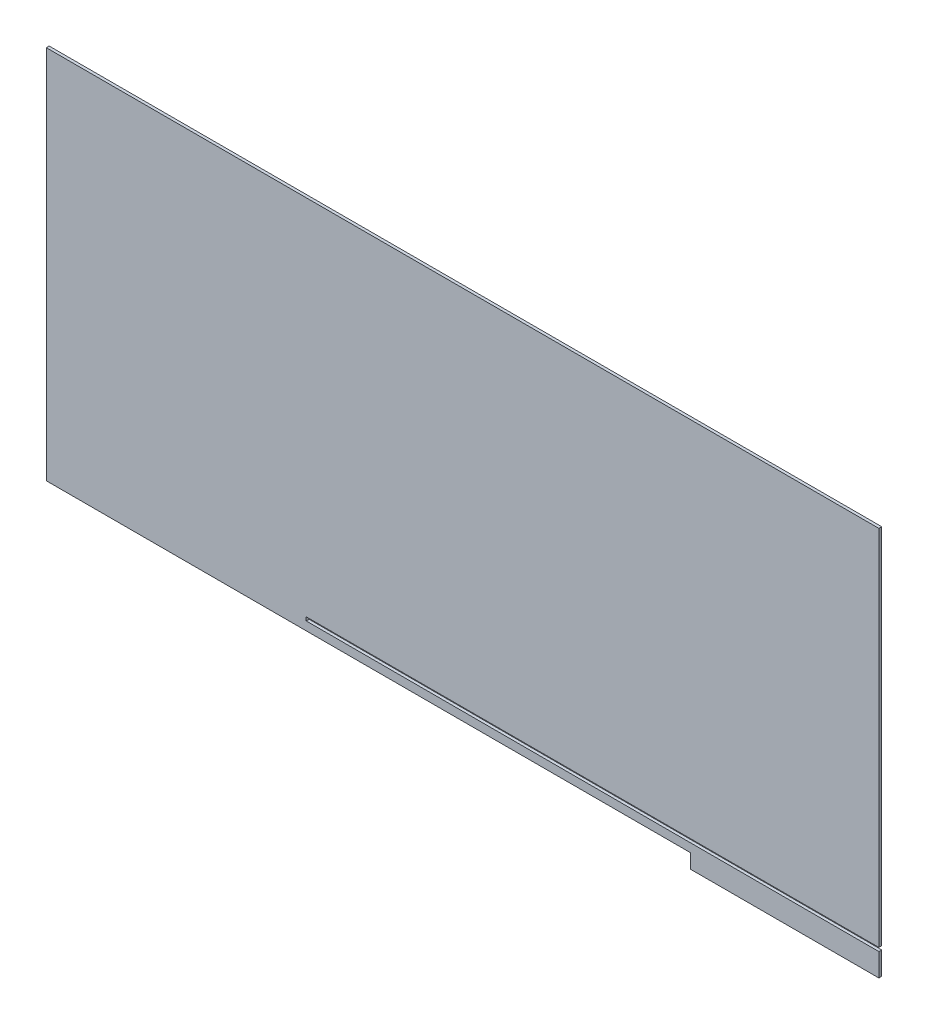
ISO-10303-21;
HEADER;
FILE_DESCRIPTION(('STEP AP214'),'2;1');
FILE_NAME('part.step','',(''),(''),'','','');
FILE_SCHEMA(('AUTOMOTIVE_DESIGN { 1 0 10303 214 1 1 1 1 }'));
ENDSEC;
DATA;
#1=APPLICATION_CONTEXT('core data for automotive mechanical design processes');
#2=APPLICATION_PROTOCOL_DEFINITION('international standard','automotive_design',2000,#1);
#3=PRODUCT_CONTEXT('',#1,'mechanical');
#4=PRODUCT('Part','Part','',(#3));
#5=PRODUCT_RELATED_PRODUCT_CATEGORY('part','',(#4));
#6=PRODUCT_DEFINITION_FORMATION('','',#4);
#7=PRODUCT_DEFINITION_CONTEXT('part definition',#1,'design');
#8=PRODUCT_DEFINITION('design','',#6,#7);
#9=PRODUCT_DEFINITION_SHAPE('','',#8);
#10=(LENGTH_UNIT() NAMED_UNIT(*) SI_UNIT(.MILLI.,.METRE.));
#11=(NAMED_UNIT(*) PLANE_ANGLE_UNIT() SI_UNIT($,.RADIAN.));
#12=(NAMED_UNIT(*) SI_UNIT($,.STERADIAN.) SOLID_ANGLE_UNIT());
#13=UNCERTAINTY_MEASURE_WITH_UNIT(LENGTH_MEASURE(1.E-05),#10,'distance_accuracy_value','');
#14=(GEOMETRIC_REPRESENTATION_CONTEXT(3) GLOBAL_UNCERTAINTY_ASSIGNED_CONTEXT((#13)) GLOBAL_UNIT_ASSIGNED_CONTEXT((#10,
#11,#12)) REPRESENTATION_CONTEXT('',''));
#15=CARTESIAN_POINT('',(0.,0.,0.));
#16=DIRECTION('',(0.,0.,1.));
#17=DIRECTION('',(1.,0.,0.));
#18=AXIS2_PLACEMENT_3D('',#15,#16,#17);
#19=CARTESIAN_POINT('',(581.59,0.,2.));
#20=DIRECTION('',(0.,1.,0.));
#21=DIRECTION('',(-1.,0.,0.));
#22=AXIS2_PLACEMENT_3D('',#19,#20,#21);
#23=PLANE('',#22);
#24=DIRECTION('',(0.,0.,1.));
#25=VECTOR('',#24,1.);
#26=CARTESIAN_POINT('',(449.999196590874,8.11330169714353E-12,1.99999999997949));
#27=LINE('',#26,#25);
#28=CARTESIAN_POINT('',(449.999196590874,8.08536984643307E-12,0.));
#29=VERTEX_POINT('',#28);
#30=CARTESIAN_POINT('',(449.999196590874,8.11330169714353E-12,1.99999999997949));
#31=VERTEX_POINT('',#30);
#32=EDGE_CURVE('E112',#29,#31,#27,.T.);
#33=ORIENTED_EDGE('',*,*,#32,.F.);
#34=DIRECTION('',(1.,0.,0.));
#35=VECTOR('',#34,1.);
#36=CARTESIAN_POINT('',(581.59,0.,0.));
#37=LINE('',#36,#35);
#38=CARTESIAN_POINT('',(581.59,0.,0.));
#39=VERTEX_POINT('',#38);
#40=EDGE_CURVE('E151',#29,#39,#37,.T.);
#41=ORIENTED_EDGE('',*,*,#40,.T.);
#42=DIRECTION('',(0.,0.,-1.));
#43=VECTOR('',#42,1.);
#44=CARTESIAN_POINT('',(581.59,0.,2.));
#45=LINE('',#44,#43);
#46=CARTESIAN_POINT('',(581.59,0.,2.));
#47=VERTEX_POINT('',#46);
#48=EDGE_CURVE('E132',#47,#39,#45,.T.);
#49=ORIENTED_EDGE('',*,*,#48,.F.);
#50=DIRECTION('',(1.,0.,0.));
#51=VECTOR('',#50,1.);
#52=CARTESIAN_POINT('',(581.59,0.,2.));
#53=LINE('',#52,#51);
#54=EDGE_CURVE('E127',#31,#47,#53,.T.);
#55=ORIENTED_EDGE('',*,*,#54,.F.);
#56=EDGE_LOOP('',(#33,#41,#49,#55));
#57=FACE_BOUND('',#56,.T.);
#58=ADVANCED_FACE('F35',(#57),#23,.F.);
#59=CARTESIAN_POINT('',(0.,0.,2.));
#60=DIRECTION('',(0.,0.,1.));
#61=DIRECTION('',(1.,0.,0.));
#62=AXIS2_PLACEMENT_3D('',#59,#60,#61);
#63=PLANE('',#62);
#64=DIRECTION('',(-1.,0.,0.));
#65=VECTOR('',#64,1.);
#66=CARTESIAN_POINT('',(449.999196590874,10.0000000000081,1.99999999997935));
#67=LINE('',#66,#65);
#68=CARTESIAN_POINT('',(449.999196590874,10.0000000000081,1.99999999997935));
#69=VERTEX_POINT('',#68);
#70=CARTESIAN_POINT('',(0.,9.99999999999869,1.99999999997307));
#71=VERTEX_POINT('',#70);
#72=EDGE_CURVE('E122',#69,#71,#67,.T.);
#73=ORIENTED_EDGE('',*,*,#72,.F.);
#74=DIRECTION('',(0.,1.,0.));
#75=VECTOR('',#74,1.);
#76=CARTESIAN_POINT('',(449.999196590874,8.11330169714353E-12,1.99999999997949));
#77=LINE('',#76,#75);
#78=EDGE_CURVE('E116',#31,#69,#77,.T.);
#79=ORIENTED_EDGE('',*,*,#78,.F.);
#80=ORIENTED_EDGE('',*,*,#54,.T.);
#81=DIRECTION('',(0.,1.,0.));
#82=VECTOR('',#81,1.);
#83=CARTESIAN_POINT('',(581.59,272.,2.));
#84=LINE('',#83,#82);
#85=CARTESIAN_POINT('',(581.59,16.,2.));
#86=VERTEX_POINT('',#85);
#87=EDGE_CURVE('E137',#47,#86,#84,.T.);
#88=ORIENTED_EDGE('',*,*,#87,.T.);
#89=DIRECTION('',(1.,0.,0.));
#90=VECTOR('',#89,1.);
#91=CARTESIAN_POINT('',(0.,16.,2.));
#92=LINE('',#91,#90);
#93=CARTESIAN_POINT('',(181.59,16.,2.));
#94=VERTEX_POINT('',#93);
#95=EDGE_CURVE('E193',#94,#86,#92,.T.);
#96=ORIENTED_EDGE('',*,*,#95,.F.);
#97=DIRECTION('',(0.,-1.,0.));
#98=VECTOR('',#97,1.);
#99=CARTESIAN_POINT('',(181.59,0.,2.));
#100=LINE('',#99,#98);
#101=CARTESIAN_POINT('',(181.59,18.5,2.));
#102=VERTEX_POINT('',#101);
#103=EDGE_CURVE('E148',#102,#94,#100,.T.);
#104=ORIENTED_EDGE('',*,*,#103,.F.);
#105=DIRECTION('',(-1.,0.,0.));
#106=VECTOR('',#105,1.);
#107=CARTESIAN_POINT('',(0.,18.5,2.));
#108=LINE('',#107,#106);
#109=CARTESIAN_POINT('',(581.59,18.4999999999999,2.));
#110=VERTEX_POINT('',#109);
#111=EDGE_CURVE('E191',#110,#102,#108,.T.);
#112=ORIENTED_EDGE('',*,*,#111,.F.);
#113=CARTESIAN_POINT('',(581.59,272.,2.));
#114=VERTEX_POINT('',#113);
#115=EDGE_CURVE('E134',#110,#114,#84,.T.);
#116=ORIENTED_EDGE('',*,*,#115,.T.);
#117=DIRECTION('',(-1.,0.,0.));
#118=VECTOR('',#117,1.);
#119=CARTESIAN_POINT('',(581.59,272.,2.));
#120=LINE('',#119,#118);
#121=CARTESIAN_POINT('',(0.,272.,2.));
#122=VERTEX_POINT('',#121);
#123=EDGE_CURVE('E139',#114,#122,#120,.T.);
#124=ORIENTED_EDGE('',*,*,#123,.T.);
#125=DIRECTION('',(0.,-1.,0.));
#126=VECTOR('',#125,1.);
#127=CARTESIAN_POINT('',(0.,272.,2.));
#128=LINE('',#127,#126);
#129=EDGE_CURVE('E135',#122,#71,#128,.T.);
#130=ORIENTED_EDGE('',*,*,#129,.T.);
#131=EDGE_LOOP('',(#73,#79,#80,#88,#96,#104,#112,#116,#124,#130));
#132=FACE_BOUND('',#131,.T.);
#133=ADVANCED_FACE('F125',(#132),#63,.T.);
#134=CARTESIAN_POINT('',(0.,0.,0.));
#135=DIRECTION('',(0.,0.,1.));
#136=DIRECTION('',(1.,0.,0.));
#137=AXIS2_PLACEMENT_3D('',#134,#135,#136);
#138=PLANE('',#137);
#139=DIRECTION('',(0.,-1.,0.));
#140=VECTOR('',#139,1.);
#141=CARTESIAN_POINT('',(449.999196590874,9.42698278434867E-12,0.));
#142=LINE('',#141,#140);
#143=CARTESIAN_POINT('',(449.999196590874,10.0000000000081,0.));
#144=VERTEX_POINT('',#143);
#145=EDGE_CURVE('E11',#144,#29,#142,.T.);
#146=ORIENTED_EDGE('',*,*,#145,.F.);
#147=DIRECTION('',(-1.,0.,0.));
#148=VECTOR('',#147,1.);
#149=CARTESIAN_POINT('',(-2.09488880330558E-13,9.99999999999866,0.));
#150=LINE('',#149,#148);
#151=CARTESIAN_POINT('',(0.,10.0000000000034,0.));
#152=VERTEX_POINT('',#151);
#153=EDGE_CURVE('E43',#144,#152,#150,.T.);
#154=ORIENTED_EDGE('',*,*,#153,.T.);
#155=DIRECTION('',(0.,-1.,0.));
#156=VECTOR('',#155,1.);
#157=CARTESIAN_POINT('',(0.,272.,0.));
#158=LINE('',#157,#156);
#159=CARTESIAN_POINT('',(0.,272.,0.));
#160=VERTEX_POINT('',#159);
#161=EDGE_CURVE('E147',#160,#152,#158,.T.);
#162=ORIENTED_EDGE('',*,*,#161,.F.);
#163=DIRECTION('',(-1.,0.,0.));
#164=VECTOR('',#163,1.);
#165=CARTESIAN_POINT('',(581.59,272.,0.));
#166=LINE('',#165,#164);
#167=CARTESIAN_POINT('',(581.59,272.,0.));
#168=VERTEX_POINT('',#167);
#169=EDGE_CURVE('E144',#168,#160,#166,.T.);
#170=ORIENTED_EDGE('',*,*,#169,.F.);
#171=DIRECTION('',(0.,1.,0.));
#172=VECTOR('',#171,1.);
#173=CARTESIAN_POINT('',(581.59,272.,0.));
#174=LINE('',#173,#172);
#175=CARTESIAN_POINT('',(581.59,18.4999999999999,0.));
#176=VERTEX_POINT('',#175);
#177=EDGE_CURVE('E153',#176,#168,#174,.T.);
#178=ORIENTED_EDGE('',*,*,#177,.F.);
#179=DIRECTION('',(1.,0.,0.));
#180=VECTOR('',#179,1.);
#181=CARTESIAN_POINT('',(181.59,18.5,0.));
#182=LINE('',#181,#180);
#183=CARTESIAN_POINT('',(181.59,18.5,0.));
#184=VERTEX_POINT('',#183);
#185=EDGE_CURVE('E174',#184,#176,#182,.T.);
#186=ORIENTED_EDGE('',*,*,#185,.F.);
#187=DIRECTION('',(0.,1.,0.));
#188=VECTOR('',#187,1.);
#189=CARTESIAN_POINT('',(181.59,16.,0.));
#190=LINE('',#189,#188);
#191=CARTESIAN_POINT('',(181.59,16.,0.));
#192=VERTEX_POINT('',#191);
#193=EDGE_CURVE('E58',#192,#184,#190,.T.);
#194=ORIENTED_EDGE('',*,*,#193,.F.);
#195=DIRECTION('',(-1.,0.,0.));
#196=VECTOR('',#195,1.);
#197=CARTESIAN_POINT('',(181.59,16.,0.));
#198=LINE('',#197,#196);
#199=CARTESIAN_POINT('',(581.59,16.,0.));
#200=VERTEX_POINT('',#199);
#201=EDGE_CURVE('E187',#200,#192,#198,.T.);
#202=ORIENTED_EDGE('',*,*,#201,.F.);
#203=EDGE_CURVE('E154',#39,#200,#174,.T.);
#204=ORIENTED_EDGE('',*,*,#203,.F.);
#205=ORIENTED_EDGE('',*,*,#40,.F.);
#206=EDGE_LOOP('',(#146,#154,#162,#170,#178,#186,#194,#202,#204,#205));
#207=FACE_BOUND('',#206,.T.);
#208=ADVANCED_FACE('F163',(#207),#138,.F.);
#209=CARTESIAN_POINT('',(581.59,272.,2.));
#210=DIRECTION('',(-1.,0.,0.));
#211=DIRECTION('',(0.,0.,1.));
#212=AXIS2_PLACEMENT_3D('',#209,#210,#211);
#213=PLANE('',#212);
#214=ORIENTED_EDGE('',*,*,#203,.T.);
#215=DIRECTION('',(0.,0.,-1.));
#216=VECTOR('',#215,1.);
#217=CARTESIAN_POINT('',(581.59,16.,10.));
#218=LINE('',#217,#216);
#219=EDGE_CURVE('E182',#86,#200,#218,.T.);
#220=ORIENTED_EDGE('',*,*,#219,.F.);
#221=ORIENTED_EDGE('',*,*,#87,.F.);
#222=ORIENTED_EDGE('',*,*,#48,.T.);
#223=EDGE_LOOP('',(#214,#220,#221,#222));
#224=FACE_BOUND('',#223,.T.);
#225=ADVANCED_FACE('F206',(#224),#213,.F.);
#226=CARTESIAN_POINT('',(581.59,272.,2.));
#227=DIRECTION('',(0.,-1.,0.));
#228=DIRECTION('',(1.,0.,0.));
#229=AXIS2_PLACEMENT_3D('',#226,#227,#228);
#230=PLANE('',#229);
#231=ORIENTED_EDGE('',*,*,#169,.T.);
#232=DIRECTION('',(0.,0.,-1.));
#233=VECTOR('',#232,1.);
#234=CARTESIAN_POINT('',(0.,272.,2.));
#235=LINE('',#234,#233);
#236=EDGE_CURVE('E160',#122,#160,#235,.T.);
#237=ORIENTED_EDGE('',*,*,#236,.F.);
#238=ORIENTED_EDGE('',*,*,#123,.F.);
#239=DIRECTION('',(0.,0.,-1.));
#240=VECTOR('',#239,1.);
#241=CARTESIAN_POINT('',(581.59,272.,2.));
#242=LINE('',#241,#240);
#243=EDGE_CURVE('E143',#114,#168,#242,.T.);
#244=ORIENTED_EDGE('',*,*,#243,.T.);
#245=EDGE_LOOP('',(#231,#237,#238,#244));
#246=FACE_BOUND('',#245,.T.);
#247=ADVANCED_FACE('F37',(#246),#230,.F.);
#248=CARTESIAN_POINT('',(0.,272.,2.));
#249=DIRECTION('',(1.,0.,0.));
#250=DIRECTION('',(0.,1.,0.));
#251=AXIS2_PLACEMENT_3D('',#248,#249,#250);
#252=PLANE('',#251);
#253=ORIENTED_EDGE('',*,*,#161,.T.);
#254=DIRECTION('',(0.,0.,1.));
#255=VECTOR('',#254,1.);
#256=CARTESIAN_POINT('',(0.,9.99999999999868,2.00000000000366));
#257=LINE('',#256,#255);
#258=EDGE_CURVE('E50',#152,#71,#257,.T.);
#259=ORIENTED_EDGE('',*,*,#258,.T.);
#260=ORIENTED_EDGE('',*,*,#129,.F.);
#261=ORIENTED_EDGE('',*,*,#236,.T.);
#262=EDGE_LOOP('',(#253,#259,#260,#261));
#263=FACE_BOUND('',#262,.T.);
#264=ADVANCED_FACE('F166',(#263),#252,.F.);
#265=ORIENTED_EDGE('',*,*,#115,.F.);
#266=DIRECTION('',(0.,0.,-1.));
#267=VECTOR('',#266,1.);
#268=CARTESIAN_POINT('',(581.59,18.4999999999999,10.));
#269=LINE('',#268,#267);
#270=EDGE_CURVE('E179',#110,#176,#269,.T.);
#271=ORIENTED_EDGE('',*,*,#270,.T.);
#272=ORIENTED_EDGE('',*,*,#177,.T.);
#273=ORIENTED_EDGE('',*,*,#243,.F.);
#274=EDGE_LOOP('',(#265,#271,#272,#273));
#275=FACE_BOUND('',#274,.T.);
#276=ADVANCED_FACE('F178',(#275),#213,.F.);
#277=CARTESIAN_POINT('',(181.59,16.,10.));
#278=DIRECTION('',(-1.,0.,0.));
#279=DIRECTION('',(0.,0.,1.));
#280=AXIS2_PLACEMENT_3D('',#277,#278,#279);
#281=PLANE('',#280);
#282=ORIENTED_EDGE('',*,*,#103,.T.);
#283=DIRECTION('',(0.,0.,-1.));
#284=VECTOR('',#283,1.);
#285=CARTESIAN_POINT('',(181.59,16.,10.));
#286=LINE('',#285,#284);
#287=EDGE_CURVE('E185',#94,#192,#286,.T.);
#288=ORIENTED_EDGE('',*,*,#287,.T.);
#289=ORIENTED_EDGE('',*,*,#193,.T.);
#290=DIRECTION('',(0.,0.,-1.));
#291=VECTOR('',#290,1.);
#292=CARTESIAN_POINT('',(181.59,18.5,10.));
#293=LINE('',#292,#291);
#294=EDGE_CURVE('E183',#102,#184,#293,.T.);
#295=ORIENTED_EDGE('',*,*,#294,.F.);
#296=EDGE_LOOP('',(#282,#288,#289,#295));
#297=FACE_BOUND('',#296,.T.);
#298=ADVANCED_FACE('F198',(#297),#281,.F.);
#299=CARTESIAN_POINT('',(181.59,16.,10.));
#300=DIRECTION('',(0.,-1.,0.));
#301=DIRECTION('',(1.,0.,0.));
#302=AXIS2_PLACEMENT_3D('',#299,#300,#301);
#303=PLANE('',#302);
#304=ORIENTED_EDGE('',*,*,#95,.T.);
#305=ORIENTED_EDGE('',*,*,#219,.T.);
#306=ORIENTED_EDGE('',*,*,#201,.T.);
#307=ORIENTED_EDGE('',*,*,#287,.F.);
#308=EDGE_LOOP('',(#304,#305,#306,#307));
#309=FACE_BOUND('',#308,.T.);
#310=ADVANCED_FACE('F202',(#309),#303,.F.);
#311=CARTESIAN_POINT('',(181.59,18.5,10.));
#312=DIRECTION('',(0.,1.,0.));
#313=DIRECTION('',(-1.,0.,0.));
#314=AXIS2_PLACEMENT_3D('',#311,#312,#313);
#315=PLANE('',#314);
#316=ORIENTED_EDGE('',*,*,#111,.T.);
#317=ORIENTED_EDGE('',*,*,#294,.T.);
#318=ORIENTED_EDGE('',*,*,#185,.T.);
#319=ORIENTED_EDGE('',*,*,#270,.F.);
#320=EDGE_LOOP('',(#316,#317,#318,#319));
#321=FACE_BOUND('',#320,.T.);
#322=ADVANCED_FACE('F197',(#321),#315,.F.);
#323=CARTESIAN_POINT('',(449.999196590874,8.11330169714353E-12,1.99999999997949));
#324=DIRECTION('',(-1.,0.,0.));
#325=DIRECTION('',(0.,0.,-1.));
#326=AXIS2_PLACEMENT_3D('',#323,#324,#325);
#327=PLANE('',#326);
#328=ORIENTED_EDGE('',*,*,#145,.T.);
#329=ORIENTED_EDGE('',*,*,#32,.T.);
#330=ORIENTED_EDGE('',*,*,#78,.T.);
#331=DIRECTION('',(0.,0.,1.));
#332=VECTOR('',#331,1.);
#333=CARTESIAN_POINT('',(449.999196590874,10.0000000000081,1.99999999997935));
#334=LINE('',#333,#332);
#335=EDGE_CURVE('E214',#144,#69,#334,.T.);
#336=ORIENTED_EDGE('',*,*,#335,.F.);
#337=EDGE_LOOP('',(#328,#329,#330,#336));
#338=FACE_BOUND('',#337,.T.);
#339=ADVANCED_FACE('F114',(#338),#327,.T.);
#340=CARTESIAN_POINT('',(449.999196590874,10.0000000000081,1.99999999997935));
#341=DIRECTION('',(0.,1.,0.));
#342=DIRECTION('',(0.,0.,-1.));
#343=AXIS2_PLACEMENT_3D('',#340,#341,#342);
#344=PLANE('',#343);
#345=ORIENTED_EDGE('',*,*,#153,.F.);
#346=ORIENTED_EDGE('',*,*,#335,.T.);
#347=ORIENTED_EDGE('',*,*,#72,.T.);
#348=ORIENTED_EDGE('',*,*,#258,.F.);
#349=EDGE_LOOP('',(#345,#346,#347,#348));
#350=FACE_BOUND('',#349,.T.);
#351=ADVANCED_FACE('F215',(#350),#344,.F.);
#352=CLOSED_SHELL('',(#58,#133,#208,#225,#247,#264,#276,#298,#310,#322,#339,#351));
#353=MANIFOLD_SOLID_BREP('B2',#352);
#354=ADVANCED_BREP_SHAPE_REPRESENTATION('',(#18,#353),#14);
#355=SHAPE_DEFINITION_REPRESENTATION(#9,#354);
ENDSEC;
END-ISO-10303-21;
